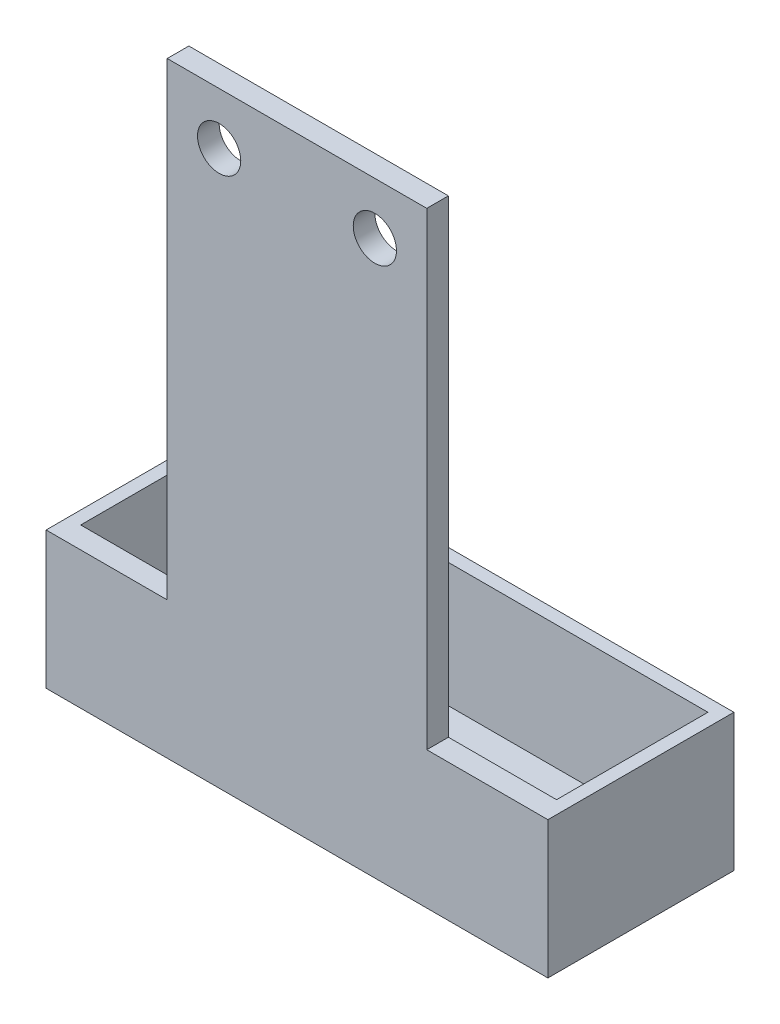
ISO-10303-21;
HEADER;
FILE_DESCRIPTION(('STEP AP214'),'2;1');
FILE_NAME('part.step','',(''),(''),'','','');
FILE_SCHEMA(('AUTOMOTIVE_DESIGN { 1 0 10303 214 1 1 1 1 }'));
ENDSEC;
DATA;
#1=APPLICATION_CONTEXT('core data for automotive mechanical design processes');
#2=APPLICATION_PROTOCOL_DEFINITION('international standard','automotive_design',2000,#1);
#3=PRODUCT_CONTEXT('',#1,'mechanical');
#4=PRODUCT('Part','Part','',(#3));
#5=PRODUCT_RELATED_PRODUCT_CATEGORY('part','',(#4));
#6=PRODUCT_DEFINITION_FORMATION('','',#4);
#7=PRODUCT_DEFINITION_CONTEXT('part definition',#1,'design');
#8=PRODUCT_DEFINITION('design','',#6,#7);
#9=PRODUCT_DEFINITION_SHAPE('','',#8);
#10=(LENGTH_UNIT() NAMED_UNIT(*) SI_UNIT(.MILLI.,.METRE.));
#11=(NAMED_UNIT(*) PLANE_ANGLE_UNIT() SI_UNIT($,.RADIAN.));
#12=(NAMED_UNIT(*) SI_UNIT($,.STERADIAN.) SOLID_ANGLE_UNIT());
#13=UNCERTAINTY_MEASURE_WITH_UNIT(LENGTH_MEASURE(1.E-05),#10,'distance_accuracy_value','');
#14=(GEOMETRIC_REPRESENTATION_CONTEXT(3) GLOBAL_UNCERTAINTY_ASSIGNED_CONTEXT((#13)) GLOBAL_UNIT_ASSIGNED_CONTEXT((#10,
#11,#12)) REPRESENTATION_CONTEXT('',''));
#15=CARTESIAN_POINT('',(0.,0.,0.));
#16=DIRECTION('',(0.,0.,1.));
#17=DIRECTION('',(1.,0.,0.));
#18=AXIS2_PLACEMENT_3D('',#15,#16,#17);
#19=CARTESIAN_POINT('',(-30.006166306081,-35.9664626597585,5.));
#20=DIRECTION('',(1.,0.,0.));
#21=DIRECTION('',(0.,1.,0.));
#22=AXIS2_PLACEMENT_3D('',#19,#20,#21);
#23=PLANE('',#22);
#24=DIRECTION('',(0.,-1.,0.));
#25=VECTOR('',#24,1.);
#26=CARTESIAN_POINT('',(-30.006166306081,-35.9664626597585,0.));
#27=LINE('',#26,#25);
#28=CARTESIAN_POINT('',(-30.006166306081,-35.9664626597585,0.));
#29=VERTEX_POINT('',#28);
#30=CARTESIAN_POINT('',(-30.006166306081,-144.356462659758,0.));
#31=VERTEX_POINT('',#30);
#32=EDGE_CURVE('E186',#29,#31,#27,.T.);
#33=ORIENTED_EDGE('',*,*,#32,.T.);
#34=DIRECTION('',(0.,0.,-1.));
#35=VECTOR('',#34,1.);
#36=CARTESIAN_POINT('',(-30.006166306081,-144.356462659758,5.));
#37=LINE('',#36,#35);
#38=CARTESIAN_POINT('',(-30.006166306081,-144.356462659758,5.));
#39=VERTEX_POINT('',#38);
#40=EDGE_CURVE('E11',#39,#31,#37,.T.);
#41=ORIENTED_EDGE('',*,*,#40,.F.);
#42=DIRECTION('',(0.,-1.,0.));
#43=VECTOR('',#42,1.);
#44=CARTESIAN_POINT('',(-30.006166306081,-35.9664626597585,5.));
#45=LINE('',#44,#43);
#46=CARTESIAN_POINT('',(-30.006166306081,-35.9664626597585,5.));
#47=VERTEX_POINT('',#46);
#48=EDGE_CURVE('E187',#47,#39,#45,.T.);
#49=ORIENTED_EDGE('',*,*,#48,.F.);
#50=DIRECTION('',(0.,0.,-1.));
#51=VECTOR('',#50,1.);
#52=CARTESIAN_POINT('',(-30.006166306081,-35.9664626597585,5.));
#53=LINE('',#52,#51);
#54=EDGE_CURVE('E204',#47,#29,#53,.T.);
#55=ORIENTED_EDGE('',*,*,#54,.T.);
#56=EDGE_LOOP('',(#33,#41,#49,#55));
#57=FACE_BOUND('',#56,.T.);
#58=ADVANCED_FACE('F37',(#57),#23,.F.);
#59=CARTESIAN_POINT('',(-58.006166306081,-144.356462659758,5.));
#60=DIRECTION('',(1.,0.,0.));
#61=DIRECTION('',(0.,1.,0.));
#62=AXIS2_PLACEMENT_3D('',#59,#60,#61);
#63=PLANE('',#62);
#64=DIRECTION('',(0.,0.,-1.));
#65=VECTOR('',#64,1.);
#66=CARTESIAN_POINT('',(-58.006166306081,-144.356462659758,5.));
#67=LINE('',#66,#65);
#68=CARTESIAN_POINT('',(-58.006166306081,-144.356462659758,5.));
#69=VERTEX_POINT('',#68);
#70=CARTESIAN_POINT('',(-58.006166306081,-144.356462659758,-38.));
#71=VERTEX_POINT('',#70);
#72=EDGE_CURVE('E44',#69,#71,#67,.T.);
#73=ORIENTED_EDGE('',*,*,#72,.T.);
#74=DIRECTION('',(0.,1.,0.));
#75=VECTOR('',#74,1.);
#76=CARTESIAN_POINT('',(-58.006166306081,-144.356462659758,-38.));
#77=LINE('',#76,#75);
#78=CARTESIAN_POINT('',(-58.006166306081,-176.056462659758,-38.));
#79=VERTEX_POINT('',#78);
#80=EDGE_CURVE('E144',#79,#71,#77,.T.);
#81=ORIENTED_EDGE('',*,*,#80,.F.);
#82=DIRECTION('',(0.,0.,-1.));
#83=VECTOR('',#82,1.);
#84=CARTESIAN_POINT('',(-58.006166306081,-176.056462659758,5.));
#85=LINE('',#84,#83);
#86=CARTESIAN_POINT('',(-58.006166306081,-176.056462659758,5.));
#87=VERTEX_POINT('',#86);
#88=EDGE_CURVE('E134',#87,#79,#85,.T.);
#89=ORIENTED_EDGE('',*,*,#88,.F.);
#90=DIRECTION('',(0.,-1.,0.));
#91=VECTOR('',#90,1.);
#92=CARTESIAN_POINT('',(-58.006166306081,-144.356462659758,5.));
#93=LINE('',#92,#91);
#94=EDGE_CURVE('E193',#69,#87,#93,.T.);
#95=ORIENTED_EDGE('',*,*,#94,.F.);
#96=EDGE_LOOP('',(#73,#81,#89,#95));
#97=FACE_BOUND('',#96,.T.);
#98=ADVANCED_FACE('F226',(#97),#63,.F.);
#99=CARTESIAN_POINT('',(57.993833693919,-176.056462659758,5.));
#100=DIRECTION('',(0.,1.,0.));
#101=DIRECTION('',(-1.,0.,0.));
#102=AXIS2_PLACEMENT_3D('',#99,#100,#101);
#103=PLANE('',#102);
#104=ORIENTED_EDGE('',*,*,#88,.T.);
#105=DIRECTION('',(-1.,0.,0.));
#106=VECTOR('',#105,1.);
#107=CARTESIAN_POINT('',(57.993833693919,-176.056462659758,-38.));
#108=LINE('',#107,#106);
#109=CARTESIAN_POINT('',(57.993833693919,-176.056462659758,-38.));
#110=VERTEX_POINT('',#109);
#111=EDGE_CURVE('E138',#110,#79,#108,.T.);
#112=ORIENTED_EDGE('',*,*,#111,.F.);
#113=DIRECTION('',(0.,0.,-1.));
#114=VECTOR('',#113,1.);
#115=CARTESIAN_POINT('',(57.993833693919,-176.056462659758,5.));
#116=LINE('',#115,#114);
#117=CARTESIAN_POINT('',(57.993833693919,-176.056462659758,5.));
#118=VERTEX_POINT('',#117);
#119=EDGE_CURVE('E125',#118,#110,#116,.T.);
#120=ORIENTED_EDGE('',*,*,#119,.F.);
#121=DIRECTION('',(1.,0.,0.));
#122=VECTOR('',#121,1.);
#123=CARTESIAN_POINT('',(57.993833693919,-176.056462659758,5.));
#124=LINE('',#123,#122);
#125=EDGE_CURVE('E195',#87,#118,#124,.T.);
#126=ORIENTED_EDGE('',*,*,#125,.F.);
#127=EDGE_LOOP('',(#104,#112,#120,#126));
#128=FACE_BOUND('',#127,.T.);
#129=ADVANCED_FACE('F139',(#128),#103,.F.);
#130=CARTESIAN_POINT('',(57.993833693919,-144.356462659758,5.));
#131=DIRECTION('',(-1.,0.,0.));
#132=DIRECTION('',(0.,-1.,0.));
#133=AXIS2_PLACEMENT_3D('',#130,#131,#132);
#134=PLANE('',#133);
#135=ORIENTED_EDGE('',*,*,#119,.T.);
#136=DIRECTION('',(0.,-1.,0.));
#137=VECTOR('',#136,1.);
#138=CARTESIAN_POINT('',(57.993833693919,-144.356462659758,-38.));
#139=LINE('',#138,#137);
#140=CARTESIAN_POINT('',(57.993833693919,-144.356462659758,-38.));
#141=VERTEX_POINT('',#140);
#142=EDGE_CURVE('E130',#141,#110,#139,.T.);
#143=ORIENTED_EDGE('',*,*,#142,.F.);
#144=DIRECTION('',(0.,0.,-1.));
#145=VECTOR('',#144,1.);
#146=CARTESIAN_POINT('',(57.993833693919,-144.356462659758,5.));
#147=LINE('',#146,#145);
#148=CARTESIAN_POINT('',(57.993833693919,-144.356462659758,5.));
#149=VERTEX_POINT('',#148);
#150=EDGE_CURVE('E135',#149,#141,#147,.T.);
#151=ORIENTED_EDGE('',*,*,#150,.F.);
#152=DIRECTION('',(0.,1.,0.));
#153=VECTOR('',#152,1.);
#154=CARTESIAN_POINT('',(57.993833693919,-144.356462659758,5.));
#155=LINE('',#154,#153);
#156=EDGE_CURVE('E131',#118,#149,#155,.T.);
#157=ORIENTED_EDGE('',*,*,#156,.F.);
#158=EDGE_LOOP('',(#135,#143,#151,#157));
#159=FACE_BOUND('',#158,.T.);
#160=ADVANCED_FACE('F127',(#159),#134,.F.);
#161=CARTESIAN_POINT('',(57.993833693919,-144.356462659758,5.));
#162=DIRECTION('',(0.,-1.,0.));
#163=DIRECTION('',(0.,0.,-1.));
#164=AXIS2_PLACEMENT_3D('',#161,#162,#163);
#165=PLANE('',#164);
#166=ORIENTED_EDGE('',*,*,#150,.T.);
#167=DIRECTION('',(1.,0.,0.));
#168=VECTOR('',#167,1.);
#169=CARTESIAN_POINT('',(57.993833693919,-144.356462659758,-38.));
#170=LINE('',#169,#168);
#171=EDGE_CURVE('E149',#71,#141,#170,.T.);
#172=ORIENTED_EDGE('',*,*,#171,.F.);
#173=ORIENTED_EDGE('',*,*,#72,.F.);
#174=DIRECTION('',(-1.,0.,0.));
#175=VECTOR('',#174,1.);
#176=CARTESIAN_POINT('',(-30.006166306081,-144.356462659758,5.));
#177=LINE('',#176,#175);
#178=EDGE_CURVE('E190',#39,#69,#177,.T.);
#179=ORIENTED_EDGE('',*,*,#178,.F.);
#180=ORIENTED_EDGE('',*,*,#40,.T.);
#181=DIRECTION('',(-1.,0.,0.));
#182=VECTOR('',#181,1.);
#183=CARTESIAN_POINT('',(-30.006166306081,-144.356462659758,0.));
#184=LINE('',#183,#182);
#185=CARTESIAN_POINT('',(-55.006166306081,-144.356462659758,0.));
#186=VERTEX_POINT('',#185);
#187=EDGE_CURVE('E207',#31,#186,#184,.T.);
#188=ORIENTED_EDGE('',*,*,#187,.T.);
#189=DIRECTION('',(0.,0.,1.));
#190=VECTOR('',#189,1.);
#191=CARTESIAN_POINT('',(-55.006166306081,-144.356462659758,-35.));
#192=LINE('',#191,#190);
#193=CARTESIAN_POINT('',(-55.006166306081,-144.356462659758,-35.));
#194=VERTEX_POINT('',#193);
#195=EDGE_CURVE('E183',#194,#186,#192,.T.);
#196=ORIENTED_EDGE('',*,*,#195,.F.);
#197=DIRECTION('',(1.,0.,0.));
#198=VECTOR('',#197,1.);
#199=CARTESIAN_POINT('',(57.993833693919,-144.356462659758,-35.));
#200=LINE('',#199,#198);
#201=CARTESIAN_POINT('',(54.993833693919,-144.356462659758,-35.));
#202=VERTEX_POINT('',#201);
#203=EDGE_CURVE('E150',#194,#202,#200,.T.);
#204=ORIENTED_EDGE('',*,*,#203,.T.);
#205=DIRECTION('',(0.,0.,1.));
#206=VECTOR('',#205,1.);
#207=CARTESIAN_POINT('',(54.993833693919,-144.356462659758,-35.));
#208=LINE('',#207,#206);
#209=CARTESIAN_POINT('',(54.993833693919,-144.356462659758,0.));
#210=VERTEX_POINT('',#209);
#211=EDGE_CURVE('E170',#202,#210,#208,.T.);
#212=ORIENTED_EDGE('',*,*,#211,.T.);
#213=DIRECTION('',(-1.,0.,0.));
#214=VECTOR('',#213,1.);
#215=CARTESIAN_POINT('',(57.993833693919,-144.356462659758,0.));
#216=LINE('',#215,#214);
#217=CARTESIAN_POINT('',(29.993833693919,-144.356462659758,0.));
#218=VERTEX_POINT('',#217);
#219=EDGE_CURVE('E209',#210,#218,#216,.T.);
#220=ORIENTED_EDGE('',*,*,#219,.T.);
#221=DIRECTION('',(0.,0.,-1.));
#222=VECTOR('',#221,1.);
#223=CARTESIAN_POINT('',(29.993833693919,-144.356462659758,5.));
#224=LINE('',#223,#222);
#225=CARTESIAN_POINT('',(29.993833693919,-144.356462659758,5.));
#226=VERTEX_POINT('',#225);
#227=EDGE_CURVE('E219',#226,#218,#224,.T.);
#228=ORIENTED_EDGE('',*,*,#227,.F.);
#229=DIRECTION('',(-1.,0.,0.));
#230=VECTOR('',#229,1.);
#231=CARTESIAN_POINT('',(57.993833693919,-144.356462659758,5.));
#232=LINE('',#231,#230);
#233=EDGE_CURVE('E198',#149,#226,#232,.T.);
#234=ORIENTED_EDGE('',*,*,#233,.F.);
#235=EDGE_LOOP('',(#166,#172,#173,#179,#180,#188,#196,#204,#212,#220,#228,#234));
#236=FACE_BOUND('',#235,.T.);
#237=ADVANCED_FACE('F228',(#236),#165,.F.);
#238=CARTESIAN_POINT('',(29.993833693919,-35.9664626597585,5.));
#239=DIRECTION('',(-1.,0.,0.));
#240=DIRECTION('',(0.,-1.,0.));
#241=AXIS2_PLACEMENT_3D('',#238,#239,#240);
#242=PLANE('',#241);
#243=DIRECTION('',(0.,1.,0.));
#244=VECTOR('',#243,1.);
#245=CARTESIAN_POINT('',(29.993833693919,-35.9664626597585,0.));
#246=LINE('',#245,#244);
#247=CARTESIAN_POINT('',(29.993833693919,-35.9664626597585,0.));
#248=VERTEX_POINT('',#247);
#249=EDGE_CURVE('E211',#218,#248,#246,.T.);
#250=ORIENTED_EDGE('',*,*,#249,.T.);
#251=DIRECTION('',(0.,0.,-1.));
#252=VECTOR('',#251,1.);
#253=CARTESIAN_POINT('',(29.993833693919,-35.9664626597585,5.));
#254=LINE('',#253,#252);
#255=CARTESIAN_POINT('',(29.993833693919,-35.9664626597585,5.));
#256=VERTEX_POINT('',#255);
#257=EDGE_CURVE('E216',#256,#248,#254,.T.);
#258=ORIENTED_EDGE('',*,*,#257,.F.);
#259=DIRECTION('',(0.,1.,0.));
#260=VECTOR('',#259,1.);
#261=CARTESIAN_POINT('',(29.993833693919,-35.9664626597585,5.));
#262=LINE('',#261,#260);
#263=EDGE_CURVE('E200',#226,#256,#262,.T.);
#264=ORIENTED_EDGE('',*,*,#263,.F.);
#265=ORIENTED_EDGE('',*,*,#227,.T.);
#266=EDGE_LOOP('',(#250,#258,#264,#265));
#267=FACE_BOUND('',#266,.T.);
#268=ADVANCED_FACE('F247',(#267),#242,.F.);
#269=CARTESIAN_POINT('',(-30.006166306081,-35.9664626597585,5.));
#270=DIRECTION('',(0.,-1.,0.));
#271=DIRECTION('',(0.,0.,-1.));
#272=AXIS2_PLACEMENT_3D('',#269,#270,#271);
#273=PLANE('',#272);
#274=DIRECTION('',(-1.,0.,0.));
#275=VECTOR('',#274,1.);
#276=CARTESIAN_POINT('',(-30.006166306081,-35.9664626597585,0.));
#277=LINE('',#276,#275);
#278=EDGE_CURVE('E191',#248,#29,#277,.T.);
#279=ORIENTED_EDGE('',*,*,#278,.T.);
#280=ORIENTED_EDGE('',*,*,#54,.F.);
#281=DIRECTION('',(-1.,0.,0.));
#282=VECTOR('',#281,1.);
#283=CARTESIAN_POINT('',(-30.006166306081,-35.9664626597585,5.));
#284=LINE('',#283,#282);
#285=EDGE_CURVE('E202',#256,#47,#284,.T.);
#286=ORIENTED_EDGE('',*,*,#285,.F.);
#287=ORIENTED_EDGE('',*,*,#257,.T.);
#288=EDGE_LOOP('',(#279,#280,#286,#287));
#289=FACE_BOUND('',#288,.T.);
#290=ADVANCED_FACE('F244',(#289),#273,.F.);
#291=CARTESIAN_POINT('',(0.,0.,5.));
#292=DIRECTION('',(0.,0.,-1.));
#293=DIRECTION('',(-1.,0.,0.));
#294=AXIS2_PLACEMENT_3D('',#291,#292,#293);
#295=PLANE('',#294);
#296=CARTESIAN_POINT('',(17.993833693919,-47.9664626597585,5.));
#297=DIRECTION('',(0.,0.,-1.));
#298=DIRECTION('',(-1.,0.,0.));
#299=AXIS2_PLACEMENT_3D('',#296,#297,#298);
#300=CIRCLE('',#299,5.);
#301=CARTESIAN_POINT('',(12.993833693919,-47.9664626597585,5.));
#302=VERTEX_POINT('',#301);
#303=EDGE_CURVE('E153',#302,#302,#300,.T.);
#304=ORIENTED_EDGE('',*,*,#303,.T.);
#305=EDGE_LOOP('',(#304));
#306=FACE_BOUND('',#305,.T.);
#307=CARTESIAN_POINT('',(-18.006166306081,-47.9664626597585,5.));
#308=DIRECTION('',(0.,0.,-1.));
#309=DIRECTION('',(1.,0.,0.));
#310=AXIS2_PLACEMENT_3D('',#307,#308,#309);
#311=CIRCLE('',#310,5.);
#312=CARTESIAN_POINT('',(-13.006166306081,-47.9664626597585,5.));
#313=VERTEX_POINT('',#312);
#314=EDGE_CURVE('E156',#313,#313,#311,.T.);
#315=ORIENTED_EDGE('',*,*,#314,.T.);
#316=EDGE_LOOP('',(#315));
#317=FACE_BOUND('',#316,.T.);
#318=ORIENTED_EDGE('',*,*,#48,.T.);
#319=ORIENTED_EDGE('',*,*,#178,.T.);
#320=ORIENTED_EDGE('',*,*,#94,.T.);
#321=ORIENTED_EDGE('',*,*,#125,.T.);
#322=ORIENTED_EDGE('',*,*,#156,.T.);
#323=ORIENTED_EDGE('',*,*,#233,.T.);
#324=ORIENTED_EDGE('',*,*,#263,.T.);
#325=ORIENTED_EDGE('',*,*,#285,.T.);
#326=EDGE_LOOP('',(#318,#319,#320,#321,#322,#323,#324,#325));
#327=FACE_BOUND('',#326,.T.);
#328=ADVANCED_FACE('F233',(#306,#317,#327),#295,.F.);
#329=CARTESIAN_POINT('',(0.,0.,0.));
#330=DIRECTION('',(0.,0.,-1.));
#331=DIRECTION('',(-1.,0.,0.));
#332=AXIS2_PLACEMENT_3D('',#329,#330,#331);
#333=PLANE('',#332);
#334=CARTESIAN_POINT('',(17.993833693919,-47.9664626597585,0.));
#335=DIRECTION('',(0.,0.,-1.));
#336=DIRECTION('',(-1.,0.,0.));
#337=AXIS2_PLACEMENT_3D('',#334,#335,#336);
#338=CIRCLE('',#337,5.);
#339=CARTESIAN_POINT('',(12.993833693919,-47.9664626597585,0.));
#340=VERTEX_POINT('',#339);
#341=EDGE_CURVE('E455',#340,#340,#338,.T.);
#342=ORIENTED_EDGE('',*,*,#341,.F.);
#343=EDGE_LOOP('',(#342));
#344=FACE_BOUND('',#343,.T.);
#345=CARTESIAN_POINT('',(-18.006166306081,-47.9664626597585,0.));
#346=DIRECTION('',(0.,0.,-1.));
#347=DIRECTION('',(1.,0.,0.));
#348=AXIS2_PLACEMENT_3D('',#345,#346,#347);
#349=CIRCLE('',#348,5.);
#350=CARTESIAN_POINT('',(-13.006166306081,-47.9664626597585,0.));
#351=VERTEX_POINT('',#350);
#352=EDGE_CURVE('E456',#351,#351,#349,.T.);
#353=ORIENTED_EDGE('',*,*,#352,.F.);
#354=EDGE_LOOP('',(#353));
#355=FACE_BOUND('',#354,.T.);
#356=DIRECTION('',(0.,1.,0.));
#357=VECTOR('',#356,1.);
#358=CARTESIAN_POINT('',(54.993833693919,-173.056462659758,0.));
#359=LINE('',#358,#357);
#360=CARTESIAN_POINT('',(54.993833693919,-173.056462659758,0.));
#361=VERTEX_POINT('',#360);
#362=EDGE_CURVE('E51',#361,#210,#359,.T.);
#363=ORIENTED_EDGE('',*,*,#362,.F.);
#364=DIRECTION('',(1.,0.,0.));
#365=VECTOR('',#364,1.);
#366=CARTESIAN_POINT('',(-55.006166306081,-173.056462659758,0.));
#367=LINE('',#366,#365);
#368=CARTESIAN_POINT('',(-55.006166306081,-173.056462659758,0.));
#369=VERTEX_POINT('',#368);
#370=EDGE_CURVE('E172',#369,#361,#367,.T.);
#371=ORIENTED_EDGE('',*,*,#370,.F.);
#372=DIRECTION('',(0.,-1.,0.));
#373=VECTOR('',#372,1.);
#374=CARTESIAN_POINT('',(-55.006166306081,-144.356462659758,0.));
#375=LINE('',#374,#373);
#376=EDGE_CURVE('E57',#186,#369,#375,.T.);
#377=ORIENTED_EDGE('',*,*,#376,.F.);
#378=ORIENTED_EDGE('',*,*,#187,.F.);
#379=ORIENTED_EDGE('',*,*,#32,.F.);
#380=ORIENTED_EDGE('',*,*,#278,.F.);
#381=ORIENTED_EDGE('',*,*,#249,.F.);
#382=ORIENTED_EDGE('',*,*,#219,.F.);
#383=EDGE_LOOP('',(#363,#371,#377,#378,#379,#380,#381,#382));
#384=FACE_BOUND('',#383,.T.);
#385=ADVANCED_FACE('F241',(#344,#355,#384),#333,.T.);
#386=CARTESIAN_POINT('',(-55.006166306081,-144.356462659758,-35.));
#387=DIRECTION('',(-1.,0.,0.));
#388=DIRECTION('',(0.,-1.,0.));
#389=AXIS2_PLACEMENT_3D('',#386,#387,#388);
#390=PLANE('',#389);
#391=ORIENTED_EDGE('',*,*,#376,.T.);
#392=DIRECTION('',(0.,0.,1.));
#393=VECTOR('',#392,1.);
#394=CARTESIAN_POINT('',(-55.006166306081,-173.056462659758,-35.));
#395=LINE('',#394,#393);
#396=CARTESIAN_POINT('',(-55.006166306081,-173.056462659758,-35.));
#397=VERTEX_POINT('',#396);
#398=EDGE_CURVE('E180',#397,#369,#395,.T.);
#399=ORIENTED_EDGE('',*,*,#398,.F.);
#400=DIRECTION('',(0.,-1.,0.));
#401=VECTOR('',#400,1.);
#402=CARTESIAN_POINT('',(-55.006166306081,-144.356462659758,-35.));
#403=LINE('',#402,#401);
#404=EDGE_CURVE('E161',#194,#397,#403,.T.);
#405=ORIENTED_EDGE('',*,*,#404,.F.);
#406=ORIENTED_EDGE('',*,*,#195,.T.);
#407=EDGE_LOOP('',(#391,#399,#405,#406));
#408=FACE_BOUND('',#407,.T.);
#409=ADVANCED_FACE('F281',(#408),#390,.F.);
#410=CARTESIAN_POINT('',(-55.006166306081,-173.056462659758,-35.));
#411=DIRECTION('',(0.,-1.,0.));
#412=DIRECTION('',(0.,0.,-1.));
#413=AXIS2_PLACEMENT_3D('',#410,#411,#412);
#414=PLANE('',#413);
#415=ORIENTED_EDGE('',*,*,#370,.T.);
#416=DIRECTION('',(0.,0.,1.));
#417=VECTOR('',#416,1.);
#418=CARTESIAN_POINT('',(54.993833693919,-173.056462659758,-35.));
#419=LINE('',#418,#417);
#420=CARTESIAN_POINT('',(54.993833693919,-173.056462659758,-35.));
#421=VERTEX_POINT('',#420);
#422=EDGE_CURVE('E177',#421,#361,#419,.T.);
#423=ORIENTED_EDGE('',*,*,#422,.F.);
#424=DIRECTION('',(1.,0.,0.));
#425=VECTOR('',#424,1.);
#426=CARTESIAN_POINT('',(-55.006166306081,-173.056462659758,-35.));
#427=LINE('',#426,#425);
#428=EDGE_CURVE('E164',#397,#421,#427,.T.);
#429=ORIENTED_EDGE('',*,*,#428,.F.);
#430=ORIENTED_EDGE('',*,*,#398,.T.);
#431=EDGE_LOOP('',(#415,#423,#429,#430));
#432=FACE_BOUND('',#431,.T.);
#433=ADVANCED_FACE('F286',(#432),#414,.F.);
#434=CARTESIAN_POINT('',(54.993833693919,-173.056462659758,-35.));
#435=DIRECTION('',(1.,0.,0.));
#436=DIRECTION('',(0.,0.,-1.));
#437=AXIS2_PLACEMENT_3D('',#434,#435,#436);
#438=PLANE('',#437);
#439=ORIENTED_EDGE('',*,*,#362,.T.);
#440=ORIENTED_EDGE('',*,*,#211,.F.);
#441=DIRECTION('',(0.,1.,0.));
#442=VECTOR('',#441,1.);
#443=CARTESIAN_POINT('',(54.993833693919,-173.056462659758,-35.));
#444=LINE('',#443,#442);
#445=EDGE_CURVE('E167',#421,#202,#444,.T.);
#446=ORIENTED_EDGE('',*,*,#445,.F.);
#447=ORIENTED_EDGE('',*,*,#422,.T.);
#448=EDGE_LOOP('',(#439,#440,#446,#447));
#449=FACE_BOUND('',#448,.T.);
#450=ADVANCED_FACE('F299',(#449),#438,.F.);
#451=CARTESIAN_POINT('',(0.,0.,-35.));
#452=DIRECTION('',(0.,0.,-1.));
#453=DIRECTION('',(-1.,0.,0.));
#454=AXIS2_PLACEMENT_3D('',#451,#452,#453);
#455=PLANE('',#454);
#456=ORIENTED_EDGE('',*,*,#203,.F.);
#457=ORIENTED_EDGE('',*,*,#404,.T.);
#458=ORIENTED_EDGE('',*,*,#428,.T.);
#459=ORIENTED_EDGE('',*,*,#445,.T.);
#460=EDGE_LOOP('',(#456,#457,#458,#459));
#461=FACE_BOUND('',#460,.T.);
#462=ADVANCED_FACE('F310',(#461),#455,.F.);
#463=CARTESIAN_POINT('',(0.,0.,-38.));
#464=DIRECTION('',(0.,0.,-1.));
#465=DIRECTION('',(-1.,0.,0.));
#466=AXIS2_PLACEMENT_3D('',#463,#464,#465);
#467=PLANE('',#466);
#468=ORIENTED_EDGE('',*,*,#142,.T.);
#469=ORIENTED_EDGE('',*,*,#111,.T.);
#470=ORIENTED_EDGE('',*,*,#80,.T.);
#471=ORIENTED_EDGE('',*,*,#171,.T.);
#472=EDGE_LOOP('',(#468,#469,#470,#471));
#473=FACE_BOUND('',#472,.T.);
#474=ADVANCED_FACE('F147',(#473),#467,.T.);
#475=CARTESIAN_POINT('',(-18.006166306081,-47.9664626597585,5.));
#476=DIRECTION('',(0.,0.,-1.));
#477=DIRECTION('',(-1.,0.,0.));
#478=AXIS2_PLACEMENT_3D('',#475,#476,#477);
#479=CYLINDRICAL_SURFACE('',#478,5.);
#480=ORIENTED_EDGE('',*,*,#314,.F.);
#481=EDGE_LOOP('',(#480));
#482=FACE_BOUND('',#481,.T.);
#483=ORIENTED_EDGE('',*,*,#352,.T.);
#484=EDGE_LOOP('',(#483));
#485=FACE_BOUND('',#484,.T.);
#486=ADVANCED_FACE('F331',(#482,#485),#479,.F.);
#487=CARTESIAN_POINT('',(17.993833693919,-47.9664626597585,5.));
#488=DIRECTION('',(0.,0.,-1.));
#489=DIRECTION('',(-1.,0.,0.));
#490=AXIS2_PLACEMENT_3D('',#487,#488,#489);
#491=CYLINDRICAL_SURFACE('',#490,5.);
#492=ORIENTED_EDGE('',*,*,#303,.F.);
#493=EDGE_LOOP('',(#492));
#494=FACE_BOUND('',#493,.T.);
#495=ORIENTED_EDGE('',*,*,#341,.T.);
#496=EDGE_LOOP('',(#495));
#497=FACE_BOUND('',#496,.T.);
#498=ADVANCED_FACE('F362',(#494,#497),#491,.F.);
#499=CLOSED_SHELL('',(#58,#98,#129,#160,#237,#268,#290,#328,#385,#409,#433,#450,#462,#474,#486,#498));
#500=MANIFOLD_SOLID_BREP('B2',#499);
#501=ADVANCED_BREP_SHAPE_REPRESENTATION('',(#18,#500),#14);
#502=SHAPE_DEFINITION_REPRESENTATION(#9,#501);
ENDSEC;
END-ISO-10303-21;
